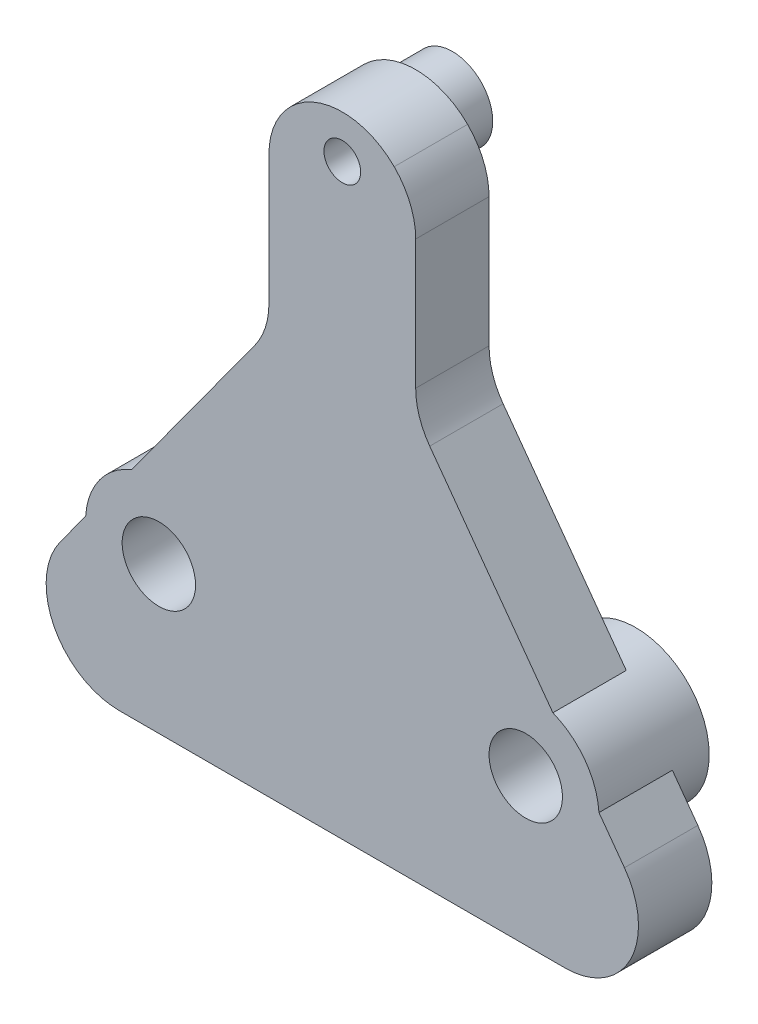
ISO-10303-21;
HEADER;
FILE_DESCRIPTION(('STEP AP214'),'2;1');
FILE_NAME('part.step','',(''),(''),'','','');
FILE_SCHEMA(('AUTOMOTIVE_DESIGN { 1 0 10303 214 1 1 1 1 }'));
ENDSEC;
DATA;
#1=APPLICATION_CONTEXT('core data for automotive mechanical design processes');
#2=APPLICATION_PROTOCOL_DEFINITION('international standard','automotive_design',2000,#1);
#3=PRODUCT_CONTEXT('',#1,'mechanical');
#4=PRODUCT('Part','Part','',(#3));
#5=PRODUCT_RELATED_PRODUCT_CATEGORY('part','',(#4));
#6=PRODUCT_DEFINITION_FORMATION('','',#4);
#7=PRODUCT_DEFINITION_CONTEXT('part definition',#1,'design');
#8=PRODUCT_DEFINITION('design','',#6,#7);
#9=PRODUCT_DEFINITION_SHAPE('','',#8);
#10=(LENGTH_UNIT() NAMED_UNIT(*) SI_UNIT(.MILLI.,.METRE.));
#11=(NAMED_UNIT(*) PLANE_ANGLE_UNIT() SI_UNIT($,.RADIAN.));
#12=(NAMED_UNIT(*) SI_UNIT($,.STERADIAN.) SOLID_ANGLE_UNIT());
#13=UNCERTAINTY_MEASURE_WITH_UNIT(LENGTH_MEASURE(1.E-05),#10,'distance_accuracy_value','');
#14=(GEOMETRIC_REPRESENTATION_CONTEXT(3) GLOBAL_UNCERTAINTY_ASSIGNED_CONTEXT((#13)) GLOBAL_UNIT_ASSIGNED_CONTEXT((#10,
#11,#12)) REPRESENTATION_CONTEXT('',''));
#15=CARTESIAN_POINT('',(0.,0.,0.));
#16=DIRECTION('',(0.,0.,1.));
#17=DIRECTION('',(1.,0.,0.));
#18=AXIS2_PLACEMENT_3D('',#15,#16,#17);
#19=CARTESIAN_POINT('',(2.,7.,2.));
#20=DIRECTION('',(-0.808736084303189,-0.588171697675046,0.));
#21=DIRECTION('',(0.588171697675046,-0.808736084303189,0.));
#22=AXIS2_PLACEMENT_3D('',#19,#20,#21);
#23=PLANE('',#22);
#24=DIRECTION('',(-0.588171697675046,0.808736084303189,0.));
#25=VECTOR('',#24,1.);
#26=CARTESIAN_POINT('',(2.,7.,0.));
#27=LINE('',#26,#25);
#28=CARTESIAN_POINT('',(7.68993207610903,-0.823656604649906,0.));
#29=VERTEX_POINT('',#28);
#30=CARTESIAN_POINT('',(6.99571195876039,0.130896056704472,0.));
#31=VERTEX_POINT('',#30);
#32=EDGE_CURVE('E157',#29,#31,#27,.T.);
#33=ORIENTED_EDGE('',*,*,#32,.T.);
#34=DIRECTION('',(0.,0.,1.));
#35=VECTOR('',#34,1.);
#36=CARTESIAN_POINT('',(6.99571195876039,0.130896056704473,-1.));
#37=LINE('',#36,#35);
#38=CARTESIAN_POINT('',(6.99571195876039,0.130896056704473,2.));
#39=VERTEX_POINT('',#38);
#40=EDGE_CURVE('E11',#31,#39,#37,.T.);
#41=ORIENTED_EDGE('',*,*,#40,.T.);
#42=DIRECTION('',(-0.588171697675046,0.808736084303189,0.));
#43=VECTOR('',#42,1.);
#44=CARTESIAN_POINT('',(2.,7.,2.));
#45=LINE('',#44,#43);
#46=CARTESIAN_POINT('',(7.68993207610903,-0.823656604649906,2.));
#47=VERTEX_POINT('',#46);
#48=EDGE_CURVE('E154',#47,#39,#45,.T.);
#49=ORIENTED_EDGE('',*,*,#48,.F.);
#50=DIRECTION('',(0.,0.,-1.));
#51=VECTOR('',#50,1.);
#52=CARTESIAN_POINT('',(7.68993207610903,-0.823656604649906,2.));
#53=LINE('',#52,#51);
#54=EDGE_CURVE('E228',#47,#29,#53,.T.);
#55=ORIENTED_EDGE('',*,*,#54,.T.);
#56=EDGE_LOOP('',(#33,#41,#49,#55));
#57=FACE_BOUND('',#56,.T.);
#58=ADVANCED_FACE('F33',(#57),#23,.F.);
#59=CARTESIAN_POINT('',(-2.,7.,2.));
#60=DIRECTION('',(0.808736084303189,-0.588171697675046,0.));
#61=DIRECTION('',(0.588171697675046,0.808736084303189,0.));
#62=AXIS2_PLACEMENT_3D('',#59,#60,#61);
#63=PLANE('',#62);
#64=DIRECTION('',(-0.588171697675046,-0.808736084303189,0.));
#65=VECTOR('',#64,1.);
#66=CARTESIAN_POINT('',(-2.,7.,0.));
#67=LINE('',#66,#65);
#68=CARTESIAN_POINT('',(-2.38252783139362,6.47402423183377,0.));
#69=VERTEX_POINT('',#68);
#70=CARTESIAN_POINT('',(-5.73942317637475,1.85829313248472,0.));
#71=VERTEX_POINT('',#70);
#72=EDGE_CURVE('E176',#69,#71,#67,.T.);
#73=ORIENTED_EDGE('',*,*,#72,.T.);
#74=DIRECTION('',(0.,0.,1.));
#75=VECTOR('',#74,1.);
#76=CARTESIAN_POINT('',(-5.73942317637475,1.85829313248472,-1.));
#77=LINE('',#76,#75);
#78=CARTESIAN_POINT('',(-5.73942317637475,1.85829313248472,2.));
#79=VERTEX_POINT('',#78);
#80=EDGE_CURVE('E259',#71,#79,#77,.T.);
#81=ORIENTED_EDGE('',*,*,#80,.T.);
#82=DIRECTION('',(-0.588171697675046,-0.808736084303189,0.));
#83=VECTOR('',#82,1.);
#84=CARTESIAN_POINT('',(-2.,7.,2.));
#85=LINE('',#84,#83);
#86=CARTESIAN_POINT('',(-2.38252783139362,6.47402423183377,2.));
#87=VERTEX_POINT('',#86);
#88=EDGE_CURVE('E304',#87,#79,#85,.T.);
#89=ORIENTED_EDGE('',*,*,#88,.F.);
#90=DIRECTION('',(0.,0.,-1.));
#91=VECTOR('',#90,1.);
#92=CARTESIAN_POINT('',(-2.38252783139362,6.47402423183377,0.));
#93=LINE('',#92,#91);
#94=EDGE_CURVE('E175',#87,#69,#93,.T.);
#95=ORIENTED_EDGE('',*,*,#94,.T.);
#96=EDGE_LOOP('',(#73,#81,#89,#95));
#97=FACE_BOUND('',#96,.T.);
#98=ADVANCED_FACE('F306',(#97),#63,.F.);
#99=CARTESIAN_POINT('',(0.,0.,2.));
#100=DIRECTION('',(0.,0.,-1.));
#101=DIRECTION('',(-1.,0.,0.));
#102=AXIS2_PLACEMENT_3D('',#99,#100,#101);
#103=PLANE('',#102);
#104=ORIENTED_EDGE('',*,*,#48,.T.);
#105=CARTESIAN_POINT('',(5.,0.,2.));
#106=DIRECTION('',(0.,0.,1.));
#107=DIRECTION('',(1.,0.,0.));
#108=AXIS2_PLACEMENT_3D('',#105,#106,#107);
#109=CIRCLE('',#108,2.);
#110=CARTESIAN_POINT('',(5.73942317637475,1.85829313248472,2.));
#111=VERTEX_POINT('',#110);
#112=EDGE_CURVE('E48',#39,#111,#109,.T.);
#113=ORIENTED_EDGE('',*,*,#112,.T.);
#114=CARTESIAN_POINT('',(2.38252783139363,6.47402423183377,2.));
#115=VERTEX_POINT('',#114);
#116=EDGE_CURVE('E164',#111,#115,#45,.T.);
#117=ORIENTED_EDGE('',*,*,#116,.T.);
#118=CARTESIAN_POINT('',(4.,7.65036762718386,2.));
#119=DIRECTION('',(0.,0.,-1.));
#120=DIRECTION('',(-1.,0.,0.));
#121=AXIS2_PLACEMENT_3D('',#118,#119,#120);
#122=CIRCLE('',#121,2.);
#123=CARTESIAN_POINT('',(2.,7.65036762718386,2.));
#124=VERTEX_POINT('',#123);
#125=EDGE_CURVE('E226',#115,#124,#122,.T.);
#126=ORIENTED_EDGE('',*,*,#125,.T.);
#127=DIRECTION('',(0.,1.,0.));
#128=VECTOR('',#127,1.);
#129=CARTESIAN_POINT('',(2.,12.,2.));
#130=LINE('',#129,#128);
#131=CARTESIAN_POINT('',(2.,11.1715728752538,2.));
#132=VERTEX_POINT('',#131);
#133=EDGE_CURVE('E163',#124,#132,#130,.T.);
#134=ORIENTED_EDGE('',*,*,#133,.T.);
#135=CARTESIAN_POINT('',(0.,11.1715728752538,2.));
#136=DIRECTION('',(0.,0.,-1.));
#137=DIRECTION('',(-1.,0.,0.));
#138=AXIS2_PLACEMENT_3D('',#135,#136,#137);
#139=CIRCLE('',#138,2.);
#140=CARTESIAN_POINT('',(1.41421356237309,12.5857864376269,2.));
#141=VERTEX_POINT('',#140);
#142=EDGE_CURVE('E217',#132,#141,#139,.F.);
#143=ORIENTED_EDGE('',*,*,#142,.T.);
#144=CARTESIAN_POINT('',(0.,11.1715728752538,2.));
#145=DIRECTION('',(0.,0.,-1.));
#146=DIRECTION('',(-1.,0.,0.));
#147=AXIS2_PLACEMENT_3D('',#144,#145,#146);
#148=CIRCLE('',#147,2.);
#149=CARTESIAN_POINT('',(-1.4142135623731,12.5857864376269,2.));
#150=VERTEX_POINT('',#149);
#151=EDGE_CURVE('E215',#141,#150,#148,.F.);
#152=ORIENTED_EDGE('',*,*,#151,.T.);
#153=CARTESIAN_POINT('',(0.,11.1715728752538,2.));
#154=DIRECTION('',(0.,0.,-1.));
#155=DIRECTION('',(-1.,0.,0.));
#156=AXIS2_PLACEMENT_3D('',#153,#154,#155);
#157=CIRCLE('',#156,2.);
#158=CARTESIAN_POINT('',(-2.,11.1715728752538,2.));
#159=VERTEX_POINT('',#158);
#160=EDGE_CURVE('E213',#150,#159,#157,.F.);
#161=ORIENTED_EDGE('',*,*,#160,.T.);
#162=DIRECTION('',(0.,-1.,0.));
#163=VECTOR('',#162,1.);
#164=CARTESIAN_POINT('',(-2.,7.,2.));
#165=LINE('',#164,#163);
#166=CARTESIAN_POINT('',(-2.,7.65036762718386,2.));
#167=VERTEX_POINT('',#166);
#168=EDGE_CURVE('E167',#159,#167,#165,.T.);
#169=ORIENTED_EDGE('',*,*,#168,.T.);
#170=CARTESIAN_POINT('',(-4.,7.65036762718386,2.));
#171=DIRECTION('',(0.,0.,-1.));
#172=DIRECTION('',(-1.,0.,0.));
#173=AXIS2_PLACEMENT_3D('',#170,#171,#172);
#174=CIRCLE('',#173,2.);
#175=EDGE_CURVE('E221',#167,#87,#174,.T.);
#176=ORIENTED_EDGE('',*,*,#175,.T.);
#177=ORIENTED_EDGE('',*,*,#88,.T.);
#178=CARTESIAN_POINT('',(-5.,0.,2.));
#179=DIRECTION('',(0.,0.,1.));
#180=DIRECTION('',(1.,0.,0.));
#181=AXIS2_PLACEMENT_3D('',#178,#179,#180);
#182=CIRCLE('',#181,2.);
#183=CARTESIAN_POINT('',(-6.99571195876038,0.130896056704472,2.));
#184=VERTEX_POINT('',#183);
#185=EDGE_CURVE('E55',#79,#184,#182,.T.);
#186=ORIENTED_EDGE('',*,*,#185,.T.);
#187=CARTESIAN_POINT('',(-7.68993207610903,-0.823656604649909,2.));
#188=VERTEX_POINT('',#187);
#189=EDGE_CURVE('E191',#184,#188,#85,.T.);
#190=ORIENTED_EDGE('',*,*,#189,.T.);
#191=CARTESIAN_POINT('',(-6.07245990750265,-2.,2.));
#192=DIRECTION('',(0.,0.,-1.));
#193=DIRECTION('',(-1.,0.,0.));
#194=AXIS2_PLACEMENT_3D('',#191,#192,#193);
#195=CIRCLE('',#194,2.);
#196=CARTESIAN_POINT('',(-6.07245990750265,-4.,2.));
#197=VERTEX_POINT('',#196);
#198=EDGE_CURVE('E247',#188,#197,#195,.F.);
#199=ORIENTED_EDGE('',*,*,#198,.T.);
#200=DIRECTION('',(1.,0.,0.));
#201=VECTOR('',#200,1.);
#202=CARTESIAN_POINT('',(-10.,-4.,2.));
#203=LINE('',#202,#201);
#204=CARTESIAN_POINT('',(6.07245990750265,-4.,2.));
#205=VERTEX_POINT('',#204);
#206=EDGE_CURVE('E169',#197,#205,#203,.T.);
#207=ORIENTED_EDGE('',*,*,#206,.T.);
#208=CARTESIAN_POINT('',(6.07245990750265,-2.,2.));
#209=DIRECTION('',(0.,0.,-1.));
#210=DIRECTION('',(-1.,0.,0.));
#211=AXIS2_PLACEMENT_3D('',#208,#209,#210);
#212=CIRCLE('',#211,2.);
#213=EDGE_CURVE('E162',#205,#47,#212,.F.);
#214=ORIENTED_EDGE('',*,*,#213,.T.);
#215=EDGE_LOOP('',(#104,#113,#117,#126,#134,#143,#152,#161,#169,#176,#177,#186,#190,#199,#207,#214));
#216=FACE_BOUND('',#215,.T.);
#217=CARTESIAN_POINT('',(0.,12.,2.));
#218=DIRECTION('',(0.,0.,1.));
#219=DIRECTION('',(1.,0.,0.));
#220=AXIS2_PLACEMENT_3D('',#217,#218,#219);
#221=CIRCLE('',#220,0.5);
#222=CARTESIAN_POINT('',(0.5,12.,2.));
#223=VERTEX_POINT('',#222);
#224=EDGE_CURVE('E235',#223,#223,#221,.T.);
#225=ORIENTED_EDGE('',*,*,#224,.F.);
#226=EDGE_LOOP('',(#225));
#227=FACE_BOUND('',#226,.T.);
#228=CARTESIAN_POINT('',(-5.,0.,2.));
#229=DIRECTION('',(0.,0.,1.));
#230=DIRECTION('',(1.,0.,0.));
#231=AXIS2_PLACEMENT_3D('',#228,#229,#230);
#232=CIRCLE('',#231,1.);
#233=CARTESIAN_POINT('',(-4.,0.,2.));
#234=VERTEX_POINT('',#233);
#235=EDGE_CURVE('E308',#234,#234,#232,.T.);
#236=ORIENTED_EDGE('',*,*,#235,.F.);
#237=EDGE_LOOP('',(#236));
#238=FACE_BOUND('',#237,.T.);
#239=CARTESIAN_POINT('',(5.,0.,2.));
#240=DIRECTION('',(0.,0.,1.));
#241=DIRECTION('',(1.,0.,0.));
#242=AXIS2_PLACEMENT_3D('',#239,#240,#241);
#243=CIRCLE('',#242,1.);
#244=CARTESIAN_POINT('',(6.,0.,2.));
#245=VERTEX_POINT('',#244);
#246=EDGE_CURVE('E311',#245,#245,#243,.T.);
#247=ORIENTED_EDGE('',*,*,#246,.F.);
#248=EDGE_LOOP('',(#247));
#249=FACE_BOUND('',#248,.T.);
#250=ADVANCED_FACE('F158',(#216,#227,#238,#249),#103,.F.);
#251=CARTESIAN_POINT('',(0.,0.,0.));
#252=DIRECTION('',(0.,0.,-1.));
#253=DIRECTION('',(-1.,0.,0.));
#254=AXIS2_PLACEMENT_3D('',#251,#252,#253);
#255=PLANE('',#254);
#256=CARTESIAN_POINT('',(5.,0.,0.));
#257=DIRECTION('',(0.,0.,-1.));
#258=DIRECTION('',(-1.,0.,0.));
#259=AXIS2_PLACEMENT_3D('',#256,#257,#258);
#260=CIRCLE('',#259,2.);
#261=CARTESIAN_POINT('',(5.73942317637475,1.85829313248472,0.));
#262=VERTEX_POINT('',#261);
#263=EDGE_CURVE('E267',#31,#262,#260,.T.);
#264=ORIENTED_EDGE('',*,*,#263,.F.);
#265=ORIENTED_EDGE('',*,*,#32,.F.);
#266=CARTESIAN_POINT('',(6.07245990750265,-2.,0.));
#267=DIRECTION('',(0.,0.,-1.));
#268=DIRECTION('',(-1.,0.,0.));
#269=AXIS2_PLACEMENT_3D('',#266,#267,#268);
#270=CIRCLE('',#269,2.);
#271=CARTESIAN_POINT('',(6.07245990750265,-4.,0.));
#272=VERTEX_POINT('',#271);
#273=EDGE_CURVE('E240',#29,#272,#270,.T.);
#274=ORIENTED_EDGE('',*,*,#273,.T.);
#275=DIRECTION('',(1.,0.,0.));
#276=VECTOR('',#275,1.);
#277=CARTESIAN_POINT('',(-10.,-4.,0.));
#278=LINE('',#277,#276);
#279=CARTESIAN_POINT('',(-6.07245990750265,-4.,0.));
#280=VERTEX_POINT('',#279);
#281=EDGE_CURVE('E179',#280,#272,#278,.T.);
#282=ORIENTED_EDGE('',*,*,#281,.F.);
#283=CARTESIAN_POINT('',(-6.07245990750265,-2.,0.));
#284=DIRECTION('',(0.,0.,-1.));
#285=DIRECTION('',(-1.,0.,0.));
#286=AXIS2_PLACEMENT_3D('',#283,#284,#285);
#287=CIRCLE('',#286,2.);
#288=CARTESIAN_POINT('',(-7.68993207610903,-0.823656604649909,0.));
#289=VERTEX_POINT('',#288);
#290=EDGE_CURVE('E237',#280,#289,#287,.T.);
#291=ORIENTED_EDGE('',*,*,#290,.T.);
#292=CARTESIAN_POINT('',(-6.99571195876038,0.130896056704471,0.));
#293=VERTEX_POINT('',#292);
#294=EDGE_CURVE('E180',#293,#289,#67,.T.);
#295=ORIENTED_EDGE('',*,*,#294,.F.);
#296=CARTESIAN_POINT('',(-5.,0.,0.));
#297=DIRECTION('',(0.,0.,-1.));
#298=DIRECTION('',(-1.,0.,0.));
#299=AXIS2_PLACEMENT_3D('',#296,#297,#298);
#300=CIRCLE('',#299,2.);
#301=EDGE_CURVE('E321',#71,#293,#300,.T.);
#302=ORIENTED_EDGE('',*,*,#301,.F.);
#303=ORIENTED_EDGE('',*,*,#72,.F.);
#304=CARTESIAN_POINT('',(-4.,7.65036762718386,0.));
#305=DIRECTION('',(0.,0.,-1.));
#306=DIRECTION('',(-1.,0.,0.));
#307=AXIS2_PLACEMENT_3D('',#304,#305,#306);
#308=CIRCLE('',#307,2.);
#309=CARTESIAN_POINT('',(-2.,7.65036762718386,0.));
#310=VERTEX_POINT('',#309);
#311=EDGE_CURVE('E219',#69,#310,#308,.F.);
#312=ORIENTED_EDGE('',*,*,#311,.T.);
#313=DIRECTION('',(0.,-1.,0.));
#314=VECTOR('',#313,1.);
#315=CARTESIAN_POINT('',(-2.,7.,0.));
#316=LINE('',#315,#314);
#317=CARTESIAN_POINT('',(-2.,11.1715728752538,0.));
#318=VERTEX_POINT('',#317);
#319=EDGE_CURVE('E188',#318,#310,#316,.T.);
#320=ORIENTED_EDGE('',*,*,#319,.F.);
#321=CARTESIAN_POINT('',(0.,11.1715728752538,0.));
#322=DIRECTION('',(0.,0.,-1.));
#323=DIRECTION('',(-1.,0.,0.));
#324=AXIS2_PLACEMENT_3D('',#321,#322,#323);
#325=CIRCLE('',#324,2.);
#326=CARTESIAN_POINT('',(-1.4142135623731,12.5857864376269,0.));
#327=VERTEX_POINT('',#326);
#328=EDGE_CURVE('E206',#318,#327,#325,.T.);
#329=ORIENTED_EDGE('',*,*,#328,.T.);
#330=CARTESIAN_POINT('',(0.,11.1715728752538,0.));
#331=DIRECTION('',(0.,0.,-1.));
#332=DIRECTION('',(-1.,0.,0.));
#333=AXIS2_PLACEMENT_3D('',#330,#331,#332);
#334=CIRCLE('',#333,2.);
#335=CARTESIAN_POINT('',(1.41421356237309,12.5857864376269,0.));
#336=VERTEX_POINT('',#335);
#337=EDGE_CURVE('E208',#327,#336,#334,.T.);
#338=ORIENTED_EDGE('',*,*,#337,.T.);
#339=CARTESIAN_POINT('',(0.,11.1715728752538,0.));
#340=DIRECTION('',(0.,0.,-1.));
#341=DIRECTION('',(-1.,0.,0.));
#342=AXIS2_PLACEMENT_3D('',#339,#340,#341);
#343=CIRCLE('',#342,2.);
#344=CARTESIAN_POINT('',(2.,11.1715728752538,0.));
#345=VERTEX_POINT('',#344);
#346=EDGE_CURVE('E211',#336,#345,#343,.T.);
#347=ORIENTED_EDGE('',*,*,#346,.T.);
#348=DIRECTION('',(0.,1.,0.));
#349=VECTOR('',#348,1.);
#350=CARTESIAN_POINT('',(2.,12.,0.));
#351=LINE('',#350,#349);
#352=CARTESIAN_POINT('',(2.,7.65036762718386,0.));
#353=VERTEX_POINT('',#352);
#354=EDGE_CURVE('E185',#353,#345,#351,.T.);
#355=ORIENTED_EDGE('',*,*,#354,.F.);
#356=CARTESIAN_POINT('',(4.,7.65036762718386,0.));
#357=DIRECTION('',(0.,0.,-1.));
#358=DIRECTION('',(-1.,0.,0.));
#359=AXIS2_PLACEMENT_3D('',#356,#357,#358);
#360=CIRCLE('',#359,2.);
#361=CARTESIAN_POINT('',(2.38252783139363,6.47402423183377,0.));
#362=VERTEX_POINT('',#361);
#363=EDGE_CURVE('E223',#353,#362,#360,.F.);
#364=ORIENTED_EDGE('',*,*,#363,.T.);
#365=EDGE_CURVE('E183',#262,#362,#27,.T.);
#366=ORIENTED_EDGE('',*,*,#365,.F.);
#367=EDGE_LOOP('',(#264,#265,#274,#282,#291,#295,#302,#303,#312,#320,#329,#338,#347,#355,#364,#366));
#368=FACE_BOUND('',#367,.T.);
#369=CARTESIAN_POINT('',(0.,12.,0.));
#370=DIRECTION('',(0.,0.,-1.));
#371=DIRECTION('',(-1.,0.,0.));
#372=AXIS2_PLACEMENT_3D('',#369,#370,#371);
#373=CIRCLE('',#372,1.1);
#374=CARTESIAN_POINT('',(-1.1,12.,0.));
#375=VERTEX_POINT('',#374);
#376=EDGE_CURVE('E253',#375,#375,#373,.T.);
#377=ORIENTED_EDGE('',*,*,#376,.F.);
#378=EDGE_LOOP('',(#377));
#379=FACE_BOUND('',#378,.T.);
#380=ADVANCED_FACE('F265',(#368,#379),#255,.T.);
#381=ORIENTED_EDGE('',*,*,#189,.F.);
#382=DIRECTION('',(0.,0.,1.));
#383=VECTOR('',#382,1.);
#384=CARTESIAN_POINT('',(-6.99571195876038,0.130896056704471,-1.));
#385=LINE('',#384,#383);
#386=EDGE_CURVE('E256',#184,#293,#385,.F.);
#387=ORIENTED_EDGE('',*,*,#386,.T.);
#388=ORIENTED_EDGE('',*,*,#294,.T.);
#389=DIRECTION('',(0.,0.,-1.));
#390=VECTOR('',#389,1.);
#391=CARTESIAN_POINT('',(-7.68993207610903,-0.823656604649909,2.));
#392=LINE('',#391,#390);
#393=EDGE_CURVE('E250',#289,#188,#392,.F.);
#394=ORIENTED_EDGE('',*,*,#393,.T.);
#395=EDGE_LOOP('',(#381,#387,#388,#394));
#396=FACE_BOUND('',#395,.T.);
#397=ADVANCED_FACE('F359',(#396),#63,.F.);
#398=CARTESIAN_POINT('',(-10.,-4.,2.));
#399=DIRECTION('',(0.,1.,0.));
#400=DIRECTION('',(-1.,0.,0.));
#401=AXIS2_PLACEMENT_3D('',#398,#399,#400);
#402=PLANE('',#401);
#403=ORIENTED_EDGE('',*,*,#281,.T.);
#404=DIRECTION('',(0.,0.,-1.));
#405=VECTOR('',#404,1.);
#406=CARTESIAN_POINT('',(6.07245990750265,-4.,2.));
#407=LINE('',#406,#405);
#408=EDGE_CURVE('E245',#272,#205,#407,.F.);
#409=ORIENTED_EDGE('',*,*,#408,.T.);
#410=ORIENTED_EDGE('',*,*,#206,.F.);
#411=DIRECTION('',(0.,0.,-1.));
#412=VECTOR('',#411,1.);
#413=CARTESIAN_POINT('',(-6.07245990750265,-4.,2.));
#414=LINE('',#413,#412);
#415=EDGE_CURVE('E242',#197,#280,#414,.T.);
#416=ORIENTED_EDGE('',*,*,#415,.T.);
#417=EDGE_LOOP('',(#403,#409,#410,#416));
#418=FACE_BOUND('',#417,.T.);
#419=ADVANCED_FACE('F363',(#418),#402,.F.);
#420=ORIENTED_EDGE('',*,*,#116,.F.);
#421=DIRECTION('',(0.,0.,1.));
#422=VECTOR('',#421,1.);
#423=CARTESIAN_POINT('',(5.73942317637475,1.85829313248472,-1.));
#424=LINE('',#423,#422);
#425=EDGE_CURVE('E41',#111,#262,#424,.F.);
#426=ORIENTED_EDGE('',*,*,#425,.T.);
#427=ORIENTED_EDGE('',*,*,#365,.T.);
#428=DIRECTION('',(0.,0.,-1.));
#429=VECTOR('',#428,1.);
#430=CARTESIAN_POINT('',(2.38252783139363,6.47402423183377,2.));
#431=LINE('',#430,#429);
#432=EDGE_CURVE('E203',#362,#115,#431,.F.);
#433=ORIENTED_EDGE('',*,*,#432,.T.);
#434=EDGE_LOOP('',(#420,#426,#427,#433));
#435=FACE_BOUND('',#434,.T.);
#436=ADVANCED_FACE('F263',(#435),#23,.F.);
#437=CARTESIAN_POINT('',(2.,12.,2.));
#438=DIRECTION('',(-1.,0.,0.));
#439=DIRECTION('',(0.,-1.,0.));
#440=AXIS2_PLACEMENT_3D('',#437,#438,#439);
#441=PLANE('',#440);
#442=ORIENTED_EDGE('',*,*,#133,.F.);
#443=DIRECTION('',(0.,0.,-1.));
#444=VECTOR('',#443,1.);
#445=CARTESIAN_POINT('',(2.,7.65036762718386,0.));
#446=LINE('',#445,#444);
#447=EDGE_CURVE('E200',#124,#353,#446,.T.);
#448=ORIENTED_EDGE('',*,*,#447,.T.);
#449=ORIENTED_EDGE('',*,*,#354,.T.);
#450=DIRECTION('',(0.,0.,-1.));
#451=VECTOR('',#450,1.);
#452=CARTESIAN_POINT('',(2.,11.1715728752538,2.));
#453=LINE('',#452,#451);
#454=EDGE_CURVE('E198',#345,#132,#453,.F.);
#455=ORIENTED_EDGE('',*,*,#454,.T.);
#456=EDGE_LOOP('',(#442,#448,#449,#455));
#457=FACE_BOUND('',#456,.T.);
#458=ADVANCED_FACE('F277',(#457),#441,.F.);
#459=CARTESIAN_POINT('',(-2.,7.,2.));
#460=DIRECTION('',(1.,0.,0.));
#461=DIRECTION('',(0.,0.,-1.));
#462=AXIS2_PLACEMENT_3D('',#459,#460,#461);
#463=PLANE('',#462);
#464=ORIENTED_EDGE('',*,*,#319,.T.);
#465=DIRECTION('',(0.,0.,-1.));
#466=VECTOR('',#465,1.);
#467=CARTESIAN_POINT('',(-2.,7.65036762718386,2.));
#468=LINE('',#467,#466);
#469=EDGE_CURVE('E196',#310,#167,#468,.F.);
#470=ORIENTED_EDGE('',*,*,#469,.T.);
#471=ORIENTED_EDGE('',*,*,#168,.F.);
#472=DIRECTION('',(0.,0.,-1.));
#473=VECTOR('',#472,1.);
#474=CARTESIAN_POINT('',(-2.,11.1715728752538,2.));
#475=LINE('',#474,#473);
#476=EDGE_CURVE('E194',#159,#318,#475,.T.);
#477=ORIENTED_EDGE('',*,*,#476,.T.);
#478=EDGE_LOOP('',(#464,#470,#471,#477));
#479=FACE_BOUND('',#478,.T.);
#480=ADVANCED_FACE('F298',(#479),#463,.F.);
#481=CARTESIAN_POINT('',(-5.,0.,2.));
#482=DIRECTION('',(0.,0.,-1.));
#483=DIRECTION('',(-1.,0.,0.));
#484=AXIS2_PLACEMENT_3D('',#481,#482,#483);
#485=CYLINDRICAL_SURFACE('',#484,1.);
#486=ORIENTED_EDGE('',*,*,#235,.T.);
#487=EDGE_LOOP('',(#486));
#488=FACE_BOUND('',#487,.T.);
#489=CARTESIAN_POINT('',(-5.,0.,-1.));
#490=DIRECTION('',(0.,0.,1.));
#491=DIRECTION('',(1.,0.,0.));
#492=AXIS2_PLACEMENT_3D('',#489,#490,#491);
#493=CIRCLE('',#492,1.);
#494=CARTESIAN_POINT('',(-4.,0.,-1.));
#495=VERTEX_POINT('',#494);
#496=EDGE_CURVE('E325',#495,#495,#493,.T.);
#497=ORIENTED_EDGE('',*,*,#496,.F.);
#498=EDGE_LOOP('',(#497));
#499=FACE_BOUND('',#498,.T.);
#500=ADVANCED_FACE('F342',(#488,#499),#485,.F.);
#501=CARTESIAN_POINT('',(5.,0.,2.));
#502=DIRECTION('',(0.,0.,-1.));
#503=DIRECTION('',(-1.,0.,0.));
#504=AXIS2_PLACEMENT_3D('',#501,#502,#503);
#505=CYLINDRICAL_SURFACE('',#504,1.);
#506=ORIENTED_EDGE('',*,*,#246,.T.);
#507=EDGE_LOOP('',(#506));
#508=FACE_BOUND('',#507,.T.);
#509=CARTESIAN_POINT('',(5.,0.,-1.));
#510=DIRECTION('',(0.,0.,1.));
#511=DIRECTION('',(1.,0.,0.));
#512=AXIS2_PLACEMENT_3D('',#509,#510,#511);
#513=CIRCLE('',#512,1.);
#514=CARTESIAN_POINT('',(6.,0.,-1.));
#515=VERTEX_POINT('',#514);
#516=EDGE_CURVE('E148',#515,#515,#513,.T.);
#517=ORIENTED_EDGE('',*,*,#516,.F.);
#518=EDGE_LOOP('',(#517));
#519=FACE_BOUND('',#518,.T.);
#520=ADVANCED_FACE('F339',(#508,#519),#505,.F.);
#521=CARTESIAN_POINT('',(0.,12.,2.));
#522=DIRECTION('',(0.,0.,-1.));
#523=DIRECTION('',(-1.,0.,0.));
#524=AXIS2_PLACEMENT_3D('',#521,#522,#523);
#525=CYLINDRICAL_SURFACE('',#524,0.5);
#526=ORIENTED_EDGE('',*,*,#224,.T.);
#527=EDGE_LOOP('',(#526));
#528=FACE_BOUND('',#527,.T.);
#529=CARTESIAN_POINT('',(0.,12.,-1.));
#530=DIRECTION('',(0.,0.,1.));
#531=DIRECTION('',(1.,0.,0.));
#532=AXIS2_PLACEMENT_3D('',#529,#530,#531);
#533=CIRCLE('',#532,0.500000000000001);
#534=CARTESIAN_POINT('',(0.500000000000001,12.,-1.));
#535=VERTEX_POINT('',#534);
#536=EDGE_CURVE('E318',#535,#535,#533,.T.);
#537=ORIENTED_EDGE('',*,*,#536,.F.);
#538=EDGE_LOOP('',(#537));
#539=FACE_BOUND('',#538,.T.);
#540=ADVANCED_FACE('F341',(#528,#539),#525,.F.);
#541=CARTESIAN_POINT('',(-4.,7.65036762718386,2.));
#542=DIRECTION('',(0.,0.,1.));
#543=DIRECTION('',(1.,0.,0.));
#544=AXIS2_PLACEMENT_3D('',#541,#542,#543);
#545=CYLINDRICAL_SURFACE('',#544,2.);
#546=ORIENTED_EDGE('',*,*,#175,.F.);
#547=ORIENTED_EDGE('',*,*,#469,.F.);
#548=ORIENTED_EDGE('',*,*,#311,.F.);
#549=ORIENTED_EDGE('',*,*,#94,.F.);
#550=EDGE_LOOP('',(#546,#547,#548,#549));
#551=FACE_BOUND('',#550,.T.);
#552=ADVANCED_FACE('F301',(#551),#545,.F.);
#553=CARTESIAN_POINT('',(4.,7.65036762718386,2.));
#554=DIRECTION('',(0.,0.,1.));
#555=DIRECTION('',(1.,0.,0.));
#556=AXIS2_PLACEMENT_3D('',#553,#554,#555);
#557=CYLINDRICAL_SURFACE('',#556,2.);
#558=ORIENTED_EDGE('',*,*,#125,.F.);
#559=ORIENTED_EDGE('',*,*,#432,.F.);
#560=ORIENTED_EDGE('',*,*,#363,.F.);
#561=ORIENTED_EDGE('',*,*,#447,.F.);
#562=EDGE_LOOP('',(#558,#559,#560,#561));
#563=FACE_BOUND('',#562,.T.);
#564=ADVANCED_FACE('F273',(#563),#557,.F.);
#565=CARTESIAN_POINT('',(0.,11.1715728752538,2.));
#566=DIRECTION('',(0.,0.,-1.));
#567=DIRECTION('',(-1.,0.,0.));
#568=AXIS2_PLACEMENT_3D('',#565,#566,#567);
#569=CYLINDRICAL_SURFACE('',#568,2.);
#570=ORIENTED_EDGE('',*,*,#454,.F.);
#571=ORIENTED_EDGE('',*,*,#346,.F.);
#572=DIRECTION('',(0.,0.,-1.));
#573=VECTOR('',#572,1.);
#574=CARTESIAN_POINT('',(1.41421356237309,12.5857864376269,2.));
#575=LINE('',#574,#573);
#576=EDGE_CURVE('E232',#141,#336,#575,.T.);
#577=ORIENTED_EDGE('',*,*,#576,.F.);
#578=ORIENTED_EDGE('',*,*,#142,.F.);
#579=EDGE_LOOP('',(#570,#571,#577,#578));
#580=FACE_BOUND('',#579,.T.);
#581=ADVANCED_FACE('F281',(#580),#569,.T.);
#582=CARTESIAN_POINT('',(0.,11.1715728752538,2.));
#583=DIRECTION('',(0.,0.,-1.));
#584=DIRECTION('',(-1.,0.,0.));
#585=AXIS2_PLACEMENT_3D('',#582,#583,#584);
#586=CYLINDRICAL_SURFACE('',#585,2.);
#587=ORIENTED_EDGE('',*,*,#476,.F.);
#588=ORIENTED_EDGE('',*,*,#160,.F.);
#589=DIRECTION('',(0.,0.,-1.));
#590=VECTOR('',#589,1.);
#591=CARTESIAN_POINT('',(-1.4142135623731,12.5857864376269,2.));
#592=LINE('',#591,#590);
#593=EDGE_CURVE('E229',#327,#150,#592,.F.);
#594=ORIENTED_EDGE('',*,*,#593,.F.);
#595=ORIENTED_EDGE('',*,*,#328,.F.);
#596=EDGE_LOOP('',(#587,#588,#594,#595));
#597=FACE_BOUND('',#596,.T.);
#598=ADVANCED_FACE('F290',(#597),#586,.T.);
#599=CARTESIAN_POINT('',(0.,11.1715728752538,2.));
#600=DIRECTION('',(0.,0.,-1.));
#601=DIRECTION('',(-1.,0.,0.));
#602=AXIS2_PLACEMENT_3D('',#599,#600,#601);
#603=CYLINDRICAL_SURFACE('',#602,2.);
#604=ORIENTED_EDGE('',*,*,#151,.F.);
#605=ORIENTED_EDGE('',*,*,#576,.T.);
#606=ORIENTED_EDGE('',*,*,#337,.F.);
#607=ORIENTED_EDGE('',*,*,#593,.T.);
#608=EDGE_LOOP('',(#604,#605,#606,#607));
#609=FACE_BOUND('',#608,.T.);
#610=ADVANCED_FACE('F293',(#609),#603,.T.);
#611=CARTESIAN_POINT('',(6.07245990750265,-2.,2.));
#612=DIRECTION('',(0.,0.,-1.));
#613=DIRECTION('',(-1.,0.,0.));
#614=AXIS2_PLACEMENT_3D('',#611,#612,#613);
#615=CYLINDRICAL_SURFACE('',#614,2.);
#616=ORIENTED_EDGE('',*,*,#213,.F.);
#617=ORIENTED_EDGE('',*,*,#408,.F.);
#618=ORIENTED_EDGE('',*,*,#273,.F.);
#619=ORIENTED_EDGE('',*,*,#54,.F.);
#620=EDGE_LOOP('',(#616,#617,#618,#619));
#621=FACE_BOUND('',#620,.T.);
#622=ADVANCED_FACE('F380',(#621),#615,.T.);
#623=CARTESIAN_POINT('',(-6.07245990750265,-2.,2.));
#624=DIRECTION('',(0.,0.,-1.));
#625=DIRECTION('',(-1.,0.,0.));
#626=AXIS2_PLACEMENT_3D('',#623,#624,#625);
#627=CYLINDRICAL_SURFACE('',#626,2.);
#628=ORIENTED_EDGE('',*,*,#198,.F.);
#629=ORIENTED_EDGE('',*,*,#393,.F.);
#630=ORIENTED_EDGE('',*,*,#290,.F.);
#631=ORIENTED_EDGE('',*,*,#415,.F.);
#632=EDGE_LOOP('',(#628,#629,#630,#631));
#633=FACE_BOUND('',#632,.T.);
#634=ADVANCED_FACE('F35',(#633),#627,.T.);
#635=CARTESIAN_POINT('',(0.,12.,-1.));
#636=DIRECTION('',(0.,0.,1.));
#637=DIRECTION('',(1.,0.,0.));
#638=AXIS2_PLACEMENT_3D('',#635,#636,#637);
#639=CYLINDRICAL_SURFACE('',#638,1.1);
#640=ORIENTED_EDGE('',*,*,#376,.T.);
#641=EDGE_LOOP('',(#640));
#642=FACE_BOUND('',#641,.T.);
#643=CARTESIAN_POINT('',(0.,12.,-1.));
#644=DIRECTION('',(0.,0.,1.));
#645=DIRECTION('',(1.,0.,0.));
#646=AXIS2_PLACEMENT_3D('',#643,#644,#645);
#647=CIRCLE('',#646,1.1);
#648=CARTESIAN_POINT('',(1.1,12.,-1.));
#649=VERTEX_POINT('',#648);
#650=EDGE_CURVE('E233',#649,#649,#647,.T.);
#651=ORIENTED_EDGE('',*,*,#650,.T.);
#652=EDGE_LOOP('',(#651));
#653=FACE_BOUND('',#652,.T.);
#654=ADVANCED_FACE('F389',(#642,#653),#639,.T.);
#655=CARTESIAN_POINT('',(0.,12.,-1.));
#656=DIRECTION('',(0.,0.,1.));
#657=DIRECTION('',(1.,0.,0.));
#658=AXIS2_PLACEMENT_3D('',#655,#656,#657);
#659=PLANE('',#658);
#660=ORIENTED_EDGE('',*,*,#536,.T.);
#661=EDGE_LOOP('',(#660));
#662=FACE_BOUND('',#661,.T.);
#663=ORIENTED_EDGE('',*,*,#650,.F.);
#664=EDGE_LOOP('',(#663));
#665=FACE_BOUND('',#664,.T.);
#666=ADVANCED_FACE('F404',(#662,#665),#659,.F.);
#667=CARTESIAN_POINT('',(-5.,0.,-1.));
#668=DIRECTION('',(0.,0.,1.));
#669=DIRECTION('',(1.,0.,0.));
#670=AXIS2_PLACEMENT_3D('',#667,#668,#669);
#671=CYLINDRICAL_SURFACE('',#670,2.);
#672=CARTESIAN_POINT('',(-5.,0.,-1.));
#673=DIRECTION('',(0.,0.,1.));
#674=DIRECTION('',(1.,0.,0.));
#675=AXIS2_PLACEMENT_3D('',#672,#673,#674);
#676=CIRCLE('',#675,2.);
#677=CARTESIAN_POINT('',(-3.,0.,-1.));
#678=VERTEX_POINT('',#677);
#679=EDGE_CURVE('E323',#678,#678,#676,.T.);
#680=ORIENTED_EDGE('',*,*,#679,.T.);
#681=EDGE_LOOP('',(#680));
#682=FACE_BOUND('',#681,.T.);
#683=ORIENTED_EDGE('',*,*,#80,.F.);
#684=ORIENTED_EDGE('',*,*,#301,.T.);
#685=ORIENTED_EDGE('',*,*,#386,.F.);
#686=ORIENTED_EDGE('',*,*,#185,.F.);
#687=EDGE_LOOP('',(#683,#684,#685,#686));
#688=FACE_BOUND('',#687,.T.);
#689=ADVANCED_FACE('F401',(#682,#688),#671,.T.);
#690=CARTESIAN_POINT('',(-5.,0.,-1.));
#691=DIRECTION('',(0.,0.,1.));
#692=DIRECTION('',(1.,0.,0.));
#693=AXIS2_PLACEMENT_3D('',#690,#691,#692);
#694=PLANE('',#693);
#695=ORIENTED_EDGE('',*,*,#496,.T.);
#696=EDGE_LOOP('',(#695));
#697=FACE_BOUND('',#696,.T.);
#698=ORIENTED_EDGE('',*,*,#679,.F.);
#699=EDGE_LOOP('',(#698));
#700=FACE_BOUND('',#699,.T.);
#701=ADVANCED_FACE('F403',(#697,#700),#694,.F.);
#702=CARTESIAN_POINT('',(5.,0.,-1.));
#703=DIRECTION('',(0.,0.,1.));
#704=DIRECTION('',(1.,0.,0.));
#705=AXIS2_PLACEMENT_3D('',#702,#703,#704);
#706=CYLINDRICAL_SURFACE('',#705,2.);
#707=CARTESIAN_POINT('',(5.,0.,-1.));
#708=DIRECTION('',(0.,0.,1.));
#709=DIRECTION('',(1.,0.,0.));
#710=AXIS2_PLACEMENT_3D('',#707,#708,#709);
#711=CIRCLE('',#710,2.);
#712=CARTESIAN_POINT('',(7.,0.,-1.));
#713=VERTEX_POINT('',#712);
#714=EDGE_CURVE('E147',#713,#713,#711,.T.);
#715=ORIENTED_EDGE('',*,*,#714,.T.);
#716=EDGE_LOOP('',(#715));
#717=FACE_BOUND('',#716,.T.);
#718=ORIENTED_EDGE('',*,*,#40,.F.);
#719=ORIENTED_EDGE('',*,*,#263,.T.);
#720=ORIENTED_EDGE('',*,*,#425,.F.);
#721=ORIENTED_EDGE('',*,*,#112,.F.);
#722=EDGE_LOOP('',(#718,#719,#720,#721));
#723=FACE_BOUND('',#722,.T.);
#724=ADVANCED_FACE('F143',(#717,#723),#706,.T.);
#725=CARTESIAN_POINT('',(5.,0.,-1.));
#726=DIRECTION('',(0.,0.,1.));
#727=DIRECTION('',(1.,0.,0.));
#728=AXIS2_PLACEMENT_3D('',#725,#726,#727);
#729=PLANE('',#728);
#730=ORIENTED_EDGE('',*,*,#516,.T.);
#731=EDGE_LOOP('',(#730));
#732=FACE_BOUND('',#731,.T.);
#733=ORIENTED_EDGE('',*,*,#714,.F.);
#734=EDGE_LOOP('',(#733));
#735=FACE_BOUND('',#734,.T.);
#736=ADVANCED_FACE('F336',(#732,#735),#729,.F.);
#737=CLOSED_SHELL('',(#58,#98,#250,#380,#397,#419,#436,#458,#480,#500,#520,#540,#552,#564,#581,
#598,#610,#622,#634,#654,#666,#689,#701,#724,#736));
#738=MANIFOLD_SOLID_BREP('B2',#737);
#739=ADVANCED_BREP_SHAPE_REPRESENTATION('',(#18,#738),#14);
#740=SHAPE_DEFINITION_REPRESENTATION(#9,#739);
ENDSEC;
END-ISO-10303-21;
